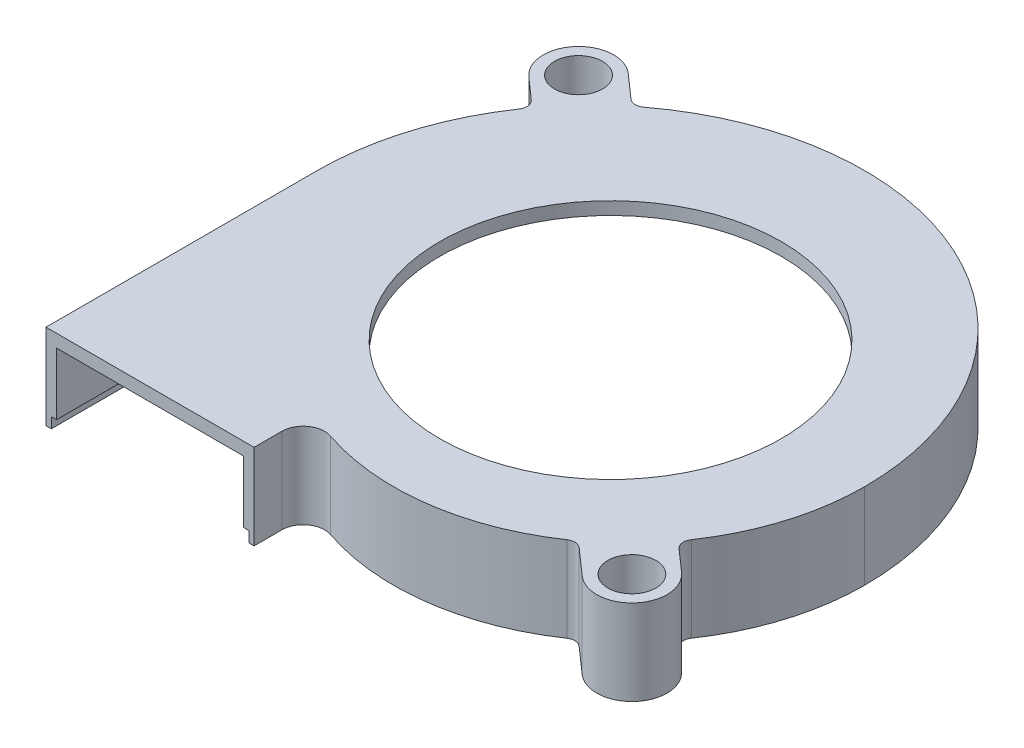
ISO-10303-21;
HEADER;
FILE_DESCRIPTION(('STEP AP214'),'2;1');
FILE_NAME('part.step','',(''),(''),'','','');
FILE_SCHEMA(('AUTOMOTIVE_DESIGN { 1 0 10303 214 1 1 1 1 }'));
ENDSEC;
DATA;
#1=APPLICATION_CONTEXT('core data for automotive mechanical design processes');
#2=APPLICATION_PROTOCOL_DEFINITION('international standard','automotive_design',2000,#1);
#3=PRODUCT_CONTEXT('',#1,'mechanical');
#4=PRODUCT('Part','Part','',(#3));
#5=PRODUCT_RELATED_PRODUCT_CATEGORY('part','',(#4));
#6=PRODUCT_DEFINITION_FORMATION('','',#4);
#7=PRODUCT_DEFINITION_CONTEXT('part definition',#1,'design');
#8=PRODUCT_DEFINITION('design','',#6,#7);
#9=PRODUCT_DEFINITION_SHAPE('','',#8);
#10=(LENGTH_UNIT() NAMED_UNIT(*) SI_UNIT(.MILLI.,.METRE.));
#11=(NAMED_UNIT(*) PLANE_ANGLE_UNIT() SI_UNIT($,.RADIAN.));
#12=(NAMED_UNIT(*) SI_UNIT($,.STERADIAN.) SOLID_ANGLE_UNIT());
#13=UNCERTAINTY_MEASURE_WITH_UNIT(LENGTH_MEASURE(1.E-05),#10,'distance_accuracy_value','');
#14=(GEOMETRIC_REPRESENTATION_CONTEXT(3) GLOBAL_UNCERTAINTY_ASSIGNED_CONTEXT((#13)) GLOBAL_UNIT_ASSIGNED_CONTEXT((#10,
#11,#12)) REPRESENTATION_CONTEXT('',''));
#15=CARTESIAN_POINT('',(0.,0.,0.));
#16=DIRECTION('',(0.,0.,1.));
#17=DIRECTION('',(1.,0.,0.));
#18=AXIS2_PLACEMENT_3D('',#15,#16,#17);
#19=CARTESIAN_POINT('',(-9.,70.26503959981,25.4));
#20=DIRECTION('',(1.,0.,0.));
#21=DIRECTION('',(0.,0.,-1.));
#22=AXIS2_PLACEMENT_3D('',#19,#20,#21);
#23=PLANE('',#22);
#24=DIRECTION('',(0.,0.,-1.));
#25=VECTOR('',#24,1.);
#26=CARTESIAN_POINT('',(-9.,-7.,22.7923029909277));
#27=LINE('',#26,#25);
#28=CARTESIAN_POINT('',(-9.,-7.,25.4));
#29=VERTEX_POINT('',#28);
#30=CARTESIAN_POINT('',(-9.,-7.,22.7923029909277));
#31=VERTEX_POINT('',#30);
#32=EDGE_CURVE('E583',#29,#31,#27,.T.);
#33=ORIENTED_EDGE('',*,*,#32,.F.);
#34=DIRECTION('',(0.,-1.,0.));
#35=VECTOR('',#34,1.);
#36=CARTESIAN_POINT('',(-9.,70.26503959981,25.4));
#37=LINE('',#36,#35);
#38=CARTESIAN_POINT('',(-9.,-1.20000000000001,25.4));
#39=VERTEX_POINT('',#38);
#40=EDGE_CURVE('E494',#39,#29,#37,.T.);
#41=ORIENTED_EDGE('',*,*,#40,.F.);
#42=DIRECTION('',(0.,0.,-1.));
#43=VECTOR('',#42,1.);
#44=CARTESIAN_POINT('',(-9.,-1.20000000000001,25.4));
#45=LINE('',#44,#43);
#46=CARTESIAN_POINT('',(-9.,-1.20000000000001,22.7923029909277));
#47=VERTEX_POINT('',#46);
#48=EDGE_CURVE('E586',#39,#47,#45,.T.);
#49=ORIENTED_EDGE('',*,*,#48,.T.);
#50=DIRECTION('',(0.,-1.,0.));
#51=VECTOR('',#50,1.);
#52=CARTESIAN_POINT('',(-9.,70.26503959981,22.7923029909277));
#53=LINE('',#52,#51);
#54=EDGE_CURVE('E498',#47,#31,#53,.T.);
#55=ORIENTED_EDGE('',*,*,#54,.T.);
#56=EDGE_LOOP('',(#33,#41,#49,#55));
#57=FACE_BOUND('',#56,.T.);
#58=ADVANCED_FACE('F34',(#57),#23,.F.);
#59=CARTESIAN_POINT('',(-6.,70.26503959981,22.7923029909277));
#60=DIRECTION('',(0.,-1.,0.));
#61=DIRECTION('',(0.,0.,-1.));
#62=AXIS2_PLACEMENT_3D('',#59,#60,#61);
#63=CYLINDRICAL_SURFACE('',#62,3.);
#64=CARTESIAN_POINT('',(-6.,-7.,22.7923029909277));
#65=DIRECTION('',(0.,-1.,0.));
#66=DIRECTION('',(0.,0.,-1.));
#67=AXIS2_PLACEMENT_3D('',#64,#65,#66);
#68=CIRCLE('',#67,3.);
#69=CARTESIAN_POINT('',(-5.036241751353,-7.,19.9513225197105));
#70=VERTEX_POINT('',#69);
#71=EDGE_CURVE('E572',#31,#70,#68,.T.);
#72=ORIENTED_EDGE('',*,*,#71,.F.);
#73=ORIENTED_EDGE('',*,*,#54,.F.);
#74=CARTESIAN_POINT('',(-6.,-1.20000000000001,22.7923029909277));
#75=DIRECTION('',(0.,-1.,0.));
#76=DIRECTION('',(0.,0.,-1.));
#77=AXIS2_PLACEMENT_3D('',#74,#75,#76);
#78=CIRCLE('',#77,3.);
#79=CARTESIAN_POINT('',(-5.0362417513355,-1.20000000000001,19.9513225196588));
#80=VERTEX_POINT('',#79);
#81=EDGE_CURVE('E485',#47,#80,#78,.T.);
#82=ORIENTED_EDGE('',*,*,#81,.T.);
#83=DIRECTION('',(0.,-1.,0.));
#84=VECTOR('',#83,1.);
#85=CARTESIAN_POINT('',(-5.0362417513355,70.26503959981,19.9513225196588));
#86=LINE('',#85,#84);
#87=EDGE_CURVE('E482',#80,#70,#86,.T.);
#88=ORIENTED_EDGE('',*,*,#87,.T.);
#89=EDGE_LOOP('',(#72,#73,#82,#88));
#90=FACE_BOUND('',#89,.T.);
#91=ADVANCED_FACE('F303',(#90),#63,.T.);
#92=CARTESIAN_POINT('',(1.73193277310925,70.26503959981,0.));
#93=DIRECTION('',(0.,-1.,0.));
#94=DIRECTION('',(0.,0.,-1.));
#95=AXIS2_PLACEMENT_3D('',#92,#93,#94);
#96=CYLINDRICAL_SURFACE('',#95,21.0680672268908);
#97=CARTESIAN_POINT('',(1.73193277310925,-7.,0.));
#98=DIRECTION('',(0.,1.,0.));
#99=DIRECTION('',(0.,0.,-1.));
#100=AXIS2_PLACEMENT_3D('',#97,#98,#99);
#101=CIRCLE('',#100,21.0680672269453);
#102=CARTESIAN_POINT('',(22.800000024916,-7.,-0.000327043078988983));
#103=VERTEX_POINT('',#102);
#104=EDGE_CURVE('E599',#70,#103,#101,.T.);
#105=ORIENTED_EDGE('',*,*,#104,.F.);
#106=ORIENTED_EDGE('',*,*,#87,.F.);
#107=CARTESIAN_POINT('',(1.73193277310925,-1.20000000000001,0.));
#108=DIRECTION('',(0.,-1.,0.));
#109=DIRECTION('',(0.,0.,-1.));
#110=AXIS2_PLACEMENT_3D('',#107,#108,#109);
#111=CIRCLE('',#110,21.0680672268908);
#112=CARTESIAN_POINT('',(22.7999999974641,-1.20000000000001,-0.000326883646344434));
#113=VERTEX_POINT('',#112);
#114=EDGE_CURVE('E476',#80,#113,#111,.F.);
#115=ORIENTED_EDGE('',*,*,#114,.T.);
#116=DIRECTION('',(0.,-1.,0.));
#117=VECTOR('',#116,1.);
#118=CARTESIAN_POINT('',(22.7999999974641,70.26503959981,-0.000326883646344434));
#119=LINE('',#118,#117);
#120=EDGE_CURVE('E480',#113,#103,#119,.T.);
#121=ORIENTED_EDGE('',*,*,#120,.T.);
#122=EDGE_LOOP('',(#105,#106,#115,#121));
#123=FACE_BOUND('',#122,.T.);
#124=ADVANCED_FACE('F309',(#123),#96,.F.);
#125=CARTESIAN_POINT('',(-1.85,70.26503959981,-0.016796874999999));
#126=DIRECTION('',(0.,-1.,0.));
#127=DIRECTION('',(0.,0.,-1.));
#128=AXIS2_PLACEMENT_3D('',#125,#126,#127);
#129=CYLINDRICAL_SURFACE('',#128,24.6500054997072);
#130=CARTESIAN_POINT('',(-1.85,-7.,-0.016796874999999));
#131=DIRECTION('',(0.,1.,0.));
#132=DIRECTION('',(0.,0.,-1.));
#133=AXIS2_PLACEMENT_3D('',#130,#131,#132);
#134=CIRCLE('',#133,24.6500055270525);
#135=CARTESIAN_POINT('',(-26.5000000525161,-7.00000000000001,-0.000327424430267257));
#136=VERTEX_POINT('',#135);
#137=EDGE_CURVE('E51',#103,#136,#134,.T.);
#138=ORIENTED_EDGE('',*,*,#137,.F.);
#139=ORIENTED_EDGE('',*,*,#120,.F.);
#140=CARTESIAN_POINT('',(-1.85,-1.20000000000001,-0.016796874999999));
#141=DIRECTION('',(0.,-1.,0.));
#142=DIRECTION('',(0.,0.,-1.));
#143=AXIS2_PLACEMENT_3D('',#140,#141,#142);
#144=CIRCLE('',#143,24.6500054997072);
#145=CARTESIAN_POINT('',(-26.5000000525161,-1.20000000000001,-0.000327424430267257));
#146=VERTEX_POINT('',#145);
#147=EDGE_CURVE('E486',#113,#146,#144,.F.);
#148=ORIENTED_EDGE('',*,*,#147,.T.);
#149=DIRECTION('',(0.,-1.,0.));
#150=VECTOR('',#149,1.);
#151=CARTESIAN_POINT('',(-26.5000000525161,70.26503959981,-0.000327424430267257));
#152=LINE('',#151,#150);
#153=EDGE_CURVE('E496',#146,#136,#152,.T.);
#154=ORIENTED_EDGE('',*,*,#153,.T.);
#155=EDGE_LOOP('',(#138,#139,#148,#154));
#156=FACE_BOUND('',#155,.T.);
#157=ADVANCED_FACE('F319',(#156),#129,.F.);
#158=CARTESIAN_POINT('',(-26.5000001072067,70.26503959981,-0.000327424393735107));
#159=DIRECTION('',(-1.,0.,4.22068338812948E-09));
#160=DIRECTION('',(4.22068338812948E-09,0.,1.));
#161=AXIS2_PLACEMENT_3D('',#158,#159,#160);
#162=PLANE('',#161);
#163=DIRECTION('',(-4.28055939719574E-11,0.,1.));
#164=VECTOR('',#163,1.);
#165=CARTESIAN_POINT('',(-26.5000000536034,-7.,25.4));
#166=LINE('',#165,#164);
#167=CARTESIAN_POINT('',(-26.5000000536034,-7.,25.4));
#168=VERTEX_POINT('',#167);
#169=EDGE_CURVE('E604',#136,#168,#166,.T.);
#170=ORIENTED_EDGE('',*,*,#169,.F.);
#171=ORIENTED_EDGE('',*,*,#153,.F.);
#172=DIRECTION('',(4.22068338812948E-09,0.,1.));
#173=VECTOR('',#172,1.);
#174=CARTESIAN_POINT('',(-26.5000001072067,-1.20000000000001,-0.000327424393735107));
#175=LINE('',#174,#173);
#176=CARTESIAN_POINT('',(-26.5,-1.20000000000001,25.4));
#177=VERTEX_POINT('',#176);
#178=EDGE_CURVE('E491',#146,#177,#175,.T.);
#179=ORIENTED_EDGE('',*,*,#178,.T.);
#180=DIRECTION('',(0.,-1.,0.));
#181=VECTOR('',#180,1.);
#182=CARTESIAN_POINT('',(-26.5,70.26503959981,25.4));
#183=LINE('',#182,#181);
#184=EDGE_CURVE('E500',#177,#168,#183,.T.);
#185=ORIENTED_EDGE('',*,*,#184,.T.);
#186=EDGE_LOOP('',(#170,#171,#179,#185));
#187=FACE_BOUND('',#186,.T.);
#188=ADVANCED_FACE('F323',(#187),#162,.F.);
#189=CARTESIAN_POINT('',(0.,-8.,0.));
#190=DIRECTION('',(0.,1.,0.));
#191=DIRECTION('',(0.,0.,1.));
#192=AXIS2_PLACEMENT_3D('',#189,#190,#191);
#193=CYLINDRICAL_SURFACE('',#192,16.);
#194=CARTESIAN_POINT('',(0.,0.,0.));
#195=DIRECTION('',(0.,1.,0.));
#196=DIRECTION('',(0.,0.,1.));
#197=AXIS2_PLACEMENT_3D('',#194,#195,#196);
#198=CIRCLE('',#197,16.);
#199=CARTESIAN_POINT('',(0.,0.,16.));
#200=VERTEX_POINT('',#199);
#201=EDGE_CURVE('E347',#200,#200,#198,.T.);
#202=ORIENTED_EDGE('',*,*,#201,.T.);
#203=EDGE_LOOP('',(#202));
#204=FACE_BOUND('',#203,.T.);
#205=CARTESIAN_POINT('',(0.,-1.2,0.));
#206=DIRECTION('',(0.,-1.,0.));
#207=DIRECTION('',(0.,0.,-1.));
#208=AXIS2_PLACEMENT_3D('',#205,#206,#207);
#209=CIRCLE('',#208,16.);
#210=CARTESIAN_POINT('',(0.,-1.2,-16.));
#211=VERTEX_POINT('',#210);
#212=EDGE_CURVE('E38',#211,#211,#209,.F.);
#213=ORIENTED_EDGE('',*,*,#212,.F.);
#214=EDGE_LOOP('',(#213));
#215=FACE_BOUND('',#214,.T.);
#216=ADVANCED_FACE('F300',(#204,#215),#193,.F.);
#217=CARTESIAN_POINT('',(-23.,-8.,-20.));
#218=DIRECTION('',(0.,1.,0.));
#219=DIRECTION('',(0.,0.,1.));
#220=AXIS2_PLACEMENT_3D('',#217,#218,#219);
#221=CYLINDRICAL_SURFACE('',#220,3.3);
#222=CARTESIAN_POINT('',(-23.,0.,-20.));
#223=DIRECTION('',(0.,1.,0.));
#224=DIRECTION('',(0.,0.,-1.));
#225=AXIS2_PLACEMENT_3D('',#222,#223,#224);
#226=CIRCLE('',#225,3.3);
#227=CARTESIAN_POINT('',(-20.8147472716434,0.,-22.4727859820878));
#228=VERTEX_POINT('',#227);
#229=CARTESIAN_POINT('',(-25.1852527283566,0.,-17.5272140179122));
#230=VERTEX_POINT('',#229);
#231=EDGE_CURVE('E208',#228,#230,#226,.T.);
#232=ORIENTED_EDGE('',*,*,#231,.F.);
#233=DIRECTION('',(0.,1.,0.));
#234=VECTOR('',#233,1.);
#235=CARTESIAN_POINT('',(-20.8147472716434,-8.,-22.4727859820878));
#236=LINE('',#235,#234);
#237=CARTESIAN_POINT('',(-20.8147472716434,-8.,-22.4727859820878));
#238=VERTEX_POINT('',#237);
#239=EDGE_CURVE('E12',#238,#228,#236,.T.);
#240=ORIENTED_EDGE('',*,*,#239,.F.);
#241=CARTESIAN_POINT('',(-23.,-8.,-20.));
#242=DIRECTION('',(0.,1.,0.));
#243=DIRECTION('',(0.,0.,-1.));
#244=AXIS2_PLACEMENT_3D('',#241,#242,#243);
#245=CIRCLE('',#244,3.3);
#246=CARTESIAN_POINT('',(-25.1852527283566,-8.,-17.5272140179122));
#247=VERTEX_POINT('',#246);
#248=EDGE_CURVE('E259',#238,#247,#245,.T.);
#249=ORIENTED_EDGE('',*,*,#248,.T.);
#250=DIRECTION('',(0.,1.,0.));
#251=VECTOR('',#250,1.);
#252=CARTESIAN_POINT('',(-25.1852527283566,-8.,-17.5272140179122));
#253=LINE('',#252,#251);
#254=EDGE_CURVE('E127',#247,#230,#253,.T.);
#255=ORIENTED_EDGE('',*,*,#254,.T.);
#256=EDGE_LOOP('',(#232,#240,#249,#255));
#257=FACE_BOUND('',#256,.T.);
#258=ADVANCED_FACE('F36',(#257),#221,.T.);
#259=CARTESIAN_POINT('',(-20.8147472716434,-8.,-22.4727859820878));
#260=DIRECTION('',(0.66219779647171,0.,-0.749329085481147));
#261=DIRECTION('',(-0.749329085481147,0.,-0.66219779647171));
#262=AXIS2_PLACEMENT_3D('',#259,#260,#261);
#263=PLANE('',#262);
#264=DIRECTION('',(-0.749329085481147,0.,-0.66219779647171));
#265=VECTOR('',#264,1.);
#266=CARTESIAN_POINT('',(-20.8147472716434,0.,-22.4727859820878));
#267=LINE('',#266,#265);
#268=CARTESIAN_POINT('',(-18.5989053771657,0.,-20.5146001218517));
#269=VERTEX_POINT('',#268);
#270=EDGE_CURVE('E257',#269,#228,#267,.T.);
#271=ORIENTED_EDGE('',*,*,#270,.F.);
#272=DIRECTION('',(0.,1.,0.));
#273=VECTOR('',#272,1.);
#274=CARTESIAN_POINT('',(-18.5989053771657,-8.,-20.5146001218517));
#275=LINE('',#274,#273);
#276=CARTESIAN_POINT('',(-18.5989053771657,-8.,-20.5146001218517));
#277=VERTEX_POINT('',#276);
#278=EDGE_CURVE('E43',#277,#269,#275,.T.);
#279=ORIENTED_EDGE('',*,*,#278,.F.);
#280=DIRECTION('',(-0.749329085481147,0.,-0.66219779647171));
#281=VECTOR('',#280,1.);
#282=CARTESIAN_POINT('',(-20.8147472716434,-8.,-22.4727859820878));
#283=LINE('',#282,#281);
#284=EDGE_CURVE('E198',#277,#238,#283,.T.);
#285=ORIENTED_EDGE('',*,*,#284,.T.);
#286=ORIENTED_EDGE('',*,*,#239,.T.);
#287=EDGE_LOOP('',(#271,#279,#285,#286));
#288=FACE_BOUND('',#287,.T.);
#289=ADVANCED_FACE('F292',(#288),#263,.T.);
#290=CARTESIAN_POINT('',(-17.936707580694,-8.,-21.2639292073329));
#291=DIRECTION('',(0.,1.,0.));
#292=DIRECTION('',(0.,0.,1.));
#293=AXIS2_PLACEMENT_3D('',#290,#291,#292);
#294=CYLINDRICAL_SURFACE('',#293,1.);
#295=CARTESIAN_POINT('',(-17.936707580694,0.,-21.2639292073329));
#296=DIRECTION('',(0.,-1.,0.));
#297=DIRECTION('',(0.,0.,1.));
#298=AXIS2_PLACEMENT_3D('',#295,#296,#297);
#299=CIRCLE('',#298,1.);
#300=CARTESIAN_POINT('',(-17.3330789029862,0.,-20.4666636183045));
#301=VERTEX_POINT('',#300);
#302=EDGE_CURVE('E183',#301,#269,#299,.T.);
#303=ORIENTED_EDGE('',*,*,#302,.F.);
#304=DIRECTION('',(0.,1.,0.));
#305=VECTOR('',#304,1.);
#306=CARTESIAN_POINT('',(-17.3330789029862,-8.,-20.4666636183045));
#307=LINE('',#306,#305);
#308=CARTESIAN_POINT('',(-17.3330789029862,-8.,-20.4666636183045));
#309=VERTEX_POINT('',#308);
#310=EDGE_CURVE('E177',#309,#301,#307,.T.);
#311=ORIENTED_EDGE('',*,*,#310,.F.);
#312=CARTESIAN_POINT('',(-17.936707580694,-8.,-21.2639292073329));
#313=DIRECTION('',(0.,-1.,0.));
#314=DIRECTION('',(0.,0.,1.));
#315=AXIS2_PLACEMENT_3D('',#312,#313,#314);
#316=CIRCLE('',#315,1.);
#317=EDGE_CURVE('E180',#309,#277,#316,.T.);
#318=ORIENTED_EDGE('',*,*,#317,.T.);
#319=ORIENTED_EDGE('',*,*,#278,.T.);
#320=EDGE_LOOP('',(#303,#311,#318,#319));
#321=FACE_BOUND('',#320,.T.);
#322=ADVANCED_FACE('F179',(#321),#294,.F.);
#323=CARTESIAN_POINT('',(-1.85,-8.,-0.016796874999999));
#324=DIRECTION('',(0.,1.,0.));
#325=DIRECTION('',(0.,0.,1.));
#326=AXIS2_PLACEMENT_3D('',#323,#324,#325);
#327=CYLINDRICAL_SURFACE('',#326,25.6500054997072);
#328=CARTESIAN_POINT('',(-1.85,0.,-0.016796874999999));
#329=DIRECTION('',(0.,1.,0.));
#330=DIRECTION('',(0.,0.,1.));
#331=AXIS2_PLACEMENT_3D('',#328,#329,#330);
#332=CIRCLE('',#331,25.6500054997072);
#333=CARTESIAN_POINT('',(23.8,0.,0.));
#334=VERTEX_POINT('',#333);
#335=EDGE_CURVE('E254',#334,#301,#332,.T.);
#336=ORIENTED_EDGE('',*,*,#335,.F.);
#337=DIRECTION('',(0.,1.,0.));
#338=VECTOR('',#337,1.);
#339=CARTESIAN_POINT('',(23.8,-8.,0.));
#340=LINE('',#339,#338);
#341=CARTESIAN_POINT('',(23.8,-8.,0.));
#342=VERTEX_POINT('',#341);
#343=EDGE_CURVE('E188',#342,#334,#340,.T.);
#344=ORIENTED_EDGE('',*,*,#343,.F.);
#345=CARTESIAN_POINT('',(-1.85,-8.,-0.016796874999999));
#346=DIRECTION('',(0.,1.,0.));
#347=DIRECTION('',(0.,0.,1.));
#348=AXIS2_PLACEMENT_3D('',#345,#346,#347);
#349=CIRCLE('',#348,25.6500054997072);
#350=EDGE_CURVE('E196',#342,#309,#349,.T.);
#351=ORIENTED_EDGE('',*,*,#350,.T.);
#352=ORIENTED_EDGE('',*,*,#310,.T.);
#353=EDGE_LOOP('',(#336,#344,#351,#352));
#354=FACE_BOUND('',#353,.T.);
#355=ADVANCED_FACE('F200',(#354),#327,.T.);
#356=CARTESIAN_POINT('',(1.73193277310925,-8.,0.));
#357=DIRECTION('',(0.,1.,0.));
#358=DIRECTION('',(0.,0.,1.));
#359=AXIS2_PLACEMENT_3D('',#356,#357,#358);
#360=CYLINDRICAL_SURFACE('',#359,22.0680672268908);
#361=CARTESIAN_POINT('',(1.73193277310925,0.,0.));
#362=DIRECTION('',(0.,1.,0.));
#363=DIRECTION('',(0.,0.,-1.));
#364=AXIS2_PLACEMENT_3D('',#361,#362,#363);
#365=CIRCLE('',#364,22.0680672268908);
#366=CARTESIAN_POINT('',(19.9790752063348,0.,12.4113409489929));
#367=VERTEX_POINT('',#366);
#368=EDGE_CURVE('E251',#367,#334,#365,.T.);
#369=ORIENTED_EDGE('',*,*,#368,.F.);
#370=DIRECTION('',(0.,1.,0.));
#371=VECTOR('',#370,1.);
#372=CARTESIAN_POINT('',(19.9790752063348,-8.,12.4113409489929));
#373=LINE('',#372,#371);
#374=CARTESIAN_POINT('',(19.9790752063348,-8.,12.4113409489929));
#375=VERTEX_POINT('',#374);
#376=EDGE_CURVE('E263',#375,#367,#373,.T.);
#377=ORIENTED_EDGE('',*,*,#376,.F.);
#378=CARTESIAN_POINT('',(1.73193277310925,-8.,0.));
#379=DIRECTION('',(0.,1.,0.));
#380=DIRECTION('',(0.,0.,-1.));
#381=AXIS2_PLACEMENT_3D('',#378,#379,#380);
#382=CIRCLE('',#381,22.0680672268908);
#383=EDGE_CURVE('E201',#375,#342,#382,.T.);
#384=ORIENTED_EDGE('',*,*,#383,.T.);
#385=ORIENTED_EDGE('',*,*,#343,.T.);
#386=EDGE_LOOP('',(#369,#377,#384,#385));
#387=FACE_BOUND('',#386,.T.);
#388=ADVANCED_FACE('F662',(#387),#360,.T.);
#389=CARTESIAN_POINT('',(20.8059325040591,-8.,12.9737527280304));
#390=DIRECTION('',(0.,1.,0.));
#391=DIRECTION('',(0.,0.,1.));
#392=AXIS2_PLACEMENT_3D('',#389,#390,#391);
#393=CYLINDRICAL_SURFACE('',#392,1.);
#394=CARTESIAN_POINT('',(20.8059325040591,0.,12.9737527280304));
#395=DIRECTION('',(0.,-1.,0.));
#396=DIRECTION('',(0.,0.,-1.));
#397=AXIS2_PLACEMENT_3D('',#394,#395,#396);
#398=CIRCLE('',#397,1.);
#399=CARTESIAN_POINT('',(20.1437347075874,0.,13.7230818135115));
#400=VERTEX_POINT('',#399);
#401=EDGE_CURVE('E248',#400,#367,#398,.T.);
#402=ORIENTED_EDGE('',*,*,#401,.F.);
#403=DIRECTION('',(0.,1.,0.));
#404=VECTOR('',#403,1.);
#405=CARTESIAN_POINT('',(20.1437347075874,-8.,13.7230818135115));
#406=LINE('',#405,#404);
#407=CARTESIAN_POINT('',(20.1437347075874,-8.,13.7230818135115));
#408=VERTEX_POINT('',#407);
#409=EDGE_CURVE('E265',#408,#400,#406,.T.);
#410=ORIENTED_EDGE('',*,*,#409,.F.);
#411=CARTESIAN_POINT('',(20.8059325040591,-8.,12.9737527280304));
#412=DIRECTION('',(0.,-1.,0.));
#413=DIRECTION('',(0.,0.,-1.));
#414=AXIS2_PLACEMENT_3D('',#411,#412,#413);
#415=CIRCLE('',#414,1.);
#416=EDGE_CURVE('E203',#408,#375,#415,.T.);
#417=ORIENTED_EDGE('',*,*,#416,.T.);
#418=ORIENTED_EDGE('',*,*,#376,.T.);
#419=EDGE_LOOP('',(#402,#410,#417,#418));
#420=FACE_BOUND('',#419,.T.);
#421=ADVANCED_FACE('F404',(#420),#393,.F.);
#422=CARTESIAN_POINT('',(22.1852527283566,-8.,15.5272140179122));
#423=DIRECTION('',(0.66219779647171,0.,-0.749329085481147));
#424=DIRECTION('',(-0.749329085481147,0.,-0.66219779647171));
#425=AXIS2_PLACEMENT_3D('',#422,#423,#424);
#426=PLANE('',#425);
#427=DIRECTION('',(-0.749329085481146,0.,-0.66219779647171));
#428=VECTOR('',#427,1.);
#429=CARTESIAN_POINT('',(22.1852527283566,0.,15.5272140179122));
#430=LINE('',#429,#428);
#431=CARTESIAN_POINT('',(22.1852527283566,0.,15.5272140179122));
#432=VERTEX_POINT('',#431);
#433=EDGE_CURVE('E245',#432,#400,#430,.T.);
#434=ORIENTED_EDGE('',*,*,#433,.F.);
#435=DIRECTION('',(0.,1.,0.));
#436=VECTOR('',#435,1.);
#437=CARTESIAN_POINT('',(22.1852527283566,-8.,15.5272140179122));
#438=LINE('',#437,#436);
#439=CARTESIAN_POINT('',(22.1852527283566,-8.,15.5272140179122));
#440=VERTEX_POINT('',#439);
#441=EDGE_CURVE('E267',#440,#432,#438,.T.);
#442=ORIENTED_EDGE('',*,*,#441,.F.);
#443=DIRECTION('',(-0.749329085481146,0.,-0.66219779647171));
#444=VECTOR('',#443,1.);
#445=CARTESIAN_POINT('',(22.1852527283566,-8.,15.5272140179122));
#446=LINE('',#445,#444);
#447=EDGE_CURVE('E398',#440,#408,#446,.T.);
#448=ORIENTED_EDGE('',*,*,#447,.T.);
#449=ORIENTED_EDGE('',*,*,#409,.T.);
#450=EDGE_LOOP('',(#434,#442,#448,#449));
#451=FACE_BOUND('',#450,.T.);
#452=ADVANCED_FACE('F410',(#451),#426,.T.);
#453=CARTESIAN_POINT('',(20.,-8.,18.));
#454=DIRECTION('',(0.,1.,0.));
#455=DIRECTION('',(0.,0.,1.));
#456=AXIS2_PLACEMENT_3D('',#453,#454,#455);
#457=CYLINDRICAL_SURFACE('',#456,3.3);
#458=CARTESIAN_POINT('',(20.,0.,18.));
#459=DIRECTION('',(0.,1.,0.));
#460=DIRECTION('',(0.,0.,-1.));
#461=AXIS2_PLACEMENT_3D('',#458,#459,#460);
#462=CIRCLE('',#461,3.3);
#463=CARTESIAN_POINT('',(17.8147472716434,0.,20.4727859820878));
#464=VERTEX_POINT('',#463);
#465=EDGE_CURVE('E242',#464,#432,#462,.T.);
#466=ORIENTED_EDGE('',*,*,#465,.F.);
#467=DIRECTION('',(0.,1.,0.));
#468=VECTOR('',#467,1.);
#469=CARTESIAN_POINT('',(17.8147472716434,-8.,20.4727859820878));
#470=LINE('',#469,#468);
#471=CARTESIAN_POINT('',(17.8147472716434,-8.,20.4727859820878));
#472=VERTEX_POINT('',#471);
#473=EDGE_CURVE('E269',#472,#464,#470,.T.);
#474=ORIENTED_EDGE('',*,*,#473,.F.);
#475=CARTESIAN_POINT('',(20.,-8.,18.));
#476=DIRECTION('',(0.,1.,0.));
#477=DIRECTION('',(0.,0.,-1.));
#478=AXIS2_PLACEMENT_3D('',#475,#476,#477);
#479=CIRCLE('',#478,3.3);
#480=EDGE_CURVE('E395',#472,#440,#479,.T.);
#481=ORIENTED_EDGE('',*,*,#480,.T.);
#482=ORIENTED_EDGE('',*,*,#441,.T.);
#483=EDGE_LOOP('',(#466,#474,#481,#482));
#484=FACE_BOUND('',#483,.T.);
#485=ADVANCED_FACE('F413',(#484),#457,.T.);
#486=CARTESIAN_POINT('',(17.8147472716434,-8.,20.4727859820878));
#487=DIRECTION('',(-0.66219779647171,0.,0.749329085481147));
#488=DIRECTION('',(0.749329085481147,0.,0.66219779647171));
#489=AXIS2_PLACEMENT_3D('',#486,#487,#488);
#490=PLANE('',#489);
#491=DIRECTION('',(0.749329085481147,0.,0.66219779647171));
#492=VECTOR('',#491,1.);
#493=CARTESIAN_POINT('',(17.8147472716434,0.,20.4727859820878));
#494=LINE('',#493,#492);
#495=CARTESIAN_POINT('',(15.3769800356374,0.,18.3184800525942));
#496=VERTEX_POINT('',#495);
#497=EDGE_CURVE('E239',#496,#464,#494,.T.);
#498=ORIENTED_EDGE('',*,*,#497,.F.);
#499=DIRECTION('',(0.,1.,0.));
#500=VECTOR('',#499,1.);
#501=CARTESIAN_POINT('',(15.3769800356374,-8.,18.3184800525942));
#502=LINE('',#501,#500);
#503=CARTESIAN_POINT('',(15.3769800356374,-8.,18.3184800525942));
#504=VERTEX_POINT('',#503);
#505=EDGE_CURVE('E271',#504,#496,#502,.T.);
#506=ORIENTED_EDGE('',*,*,#505,.F.);
#507=DIRECTION('',(0.749329085481147,0.,0.66219779647171));
#508=VECTOR('',#507,1.);
#509=CARTESIAN_POINT('',(17.8147472716434,-8.,20.4727859820878));
#510=LINE('',#509,#508);
#511=EDGE_CURVE('E392',#504,#472,#510,.T.);
#512=ORIENTED_EDGE('',*,*,#511,.T.);
#513=ORIENTED_EDGE('',*,*,#473,.T.);
#514=EDGE_LOOP('',(#498,#506,#512,#513));
#515=FACE_BOUND('',#514,.T.);
#516=ADVANCED_FACE('F418',(#515),#490,.T.);
#517=CARTESIAN_POINT('',(14.7147822391657,-8.,19.0678091380753));
#518=DIRECTION('',(0.,1.,0.));
#519=DIRECTION('',(0.,0.,1.));
#520=AXIS2_PLACEMENT_3D('',#517,#518,#519);
#521=CYLINDRICAL_SURFACE('',#520,0.999999999999999);
#522=CARTESIAN_POINT('',(14.7147822391657,0.,19.0678091380753));
#523=DIRECTION('',(0.,-1.,0.));
#524=DIRECTION('',(0.,0.,1.));
#525=AXIS2_PLACEMENT_3D('',#522,#523,#524);
#526=CIRCLE('',#525,0.999999999999999);
#527=CARTESIAN_POINT('',(14.1519761168165,0.,18.2412202023604));
#528=VERTEX_POINT('',#527);
#529=EDGE_CURVE('E236',#528,#496,#526,.T.);
#530=ORIENTED_EDGE('',*,*,#529,.F.);
#531=DIRECTION('',(0.,1.,0.));
#532=VECTOR('',#531,1.);
#533=CARTESIAN_POINT('',(14.1519761168165,-8.,18.2412202023604));
#534=LINE('',#533,#532);
#535=CARTESIAN_POINT('',(14.1519761168165,-8.,18.2412202023604));
#536=VERTEX_POINT('',#535);
#537=EDGE_CURVE('E273',#536,#528,#534,.T.);
#538=ORIENTED_EDGE('',*,*,#537,.F.);
#539=CARTESIAN_POINT('',(14.7147822391657,-8.,19.0678091380753));
#540=DIRECTION('',(0.,-1.,0.));
#541=DIRECTION('',(0.,0.,1.));
#542=AXIS2_PLACEMENT_3D('',#539,#540,#541);
#543=CIRCLE('',#542,0.999999999999999);
#544=EDGE_CURVE('E389',#536,#504,#543,.T.);
#545=ORIENTED_EDGE('',*,*,#544,.T.);
#546=ORIENTED_EDGE('',*,*,#505,.T.);
#547=EDGE_LOOP('',(#530,#538,#545,#546));
#548=FACE_BOUND('',#547,.T.);
#549=ADVANCED_FACE('F421',(#548),#521,.F.);
#550=CARTESIAN_POINT('',(1.73193277310925,-8.,0.));
#551=DIRECTION('',(0.,1.,0.));
#552=DIRECTION('',(0.,0.,1.));
#553=AXIS2_PLACEMENT_3D('',#550,#551,#552);
#554=CYLINDRICAL_SURFACE('',#553,22.0680672268908);
#555=CARTESIAN_POINT('',(1.73193277310925,0.,0.));
#556=DIRECTION('',(0.,1.,0.));
#557=DIRECTION('',(0.,0.,-1.));
#558=AXIS2_PLACEMENT_3D('',#555,#556,#557);
#559=CIRCLE('',#558,22.0680672268908);
#560=CARTESIAN_POINT('',(-5.35749450089033,0.,20.8983160100818));
#561=VERTEX_POINT('',#560);
#562=EDGE_CURVE('E233',#561,#528,#559,.T.);
#563=ORIENTED_EDGE('',*,*,#562,.F.);
#564=DIRECTION('',(0.,1.,0.));
#565=VECTOR('',#564,1.);
#566=CARTESIAN_POINT('',(-5.35749450089033,-8.,20.8983160100818));
#567=LINE('',#566,#565);
#568=CARTESIAN_POINT('',(-5.35749450089033,-8.,20.8983160100818));
#569=VERTEX_POINT('',#568);
#570=EDGE_CURVE('E275',#569,#561,#567,.T.);
#571=ORIENTED_EDGE('',*,*,#570,.F.);
#572=CARTESIAN_POINT('',(1.73193277310925,-8.,0.));
#573=DIRECTION('',(0.,1.,0.));
#574=DIRECTION('',(0.,0.,-1.));
#575=AXIS2_PLACEMENT_3D('',#572,#573,#574);
#576=CIRCLE('',#575,22.0680672268908);
#577=EDGE_CURVE('E386',#569,#536,#576,.T.);
#578=ORIENTED_EDGE('',*,*,#577,.T.);
#579=ORIENTED_EDGE('',*,*,#537,.T.);
#580=EDGE_LOOP('',(#563,#571,#578,#579));
#581=FACE_BOUND('',#580,.T.);
#582=ADVANCED_FACE('F426',(#581),#554,.T.);
#583=CARTESIAN_POINT('',(-6.,-8.,22.7923029909277));
#584=DIRECTION('',(0.,1.,0.));
#585=DIRECTION('',(0.,0.,1.));
#586=AXIS2_PLACEMENT_3D('',#583,#584,#585);
#587=CYLINDRICAL_SURFACE('',#586,2.);
#588=CARTESIAN_POINT('',(-6.,0.,22.7923029909277));
#589=DIRECTION('',(0.,-1.,0.));
#590=DIRECTION('',(0.,0.,1.));
#591=AXIS2_PLACEMENT_3D('',#588,#589,#590);
#592=CIRCLE('',#591,2.);
#593=CARTESIAN_POINT('',(-8.,0.,22.7923029909277));
#594=VERTEX_POINT('',#593);
#595=EDGE_CURVE('E230',#594,#561,#592,.T.);
#596=ORIENTED_EDGE('',*,*,#595,.F.);
#597=DIRECTION('',(0.,1.,0.));
#598=VECTOR('',#597,1.);
#599=CARTESIAN_POINT('',(-8.,-8.,22.7923029909277));
#600=LINE('',#599,#598);
#601=CARTESIAN_POINT('',(-8.,-8.,22.7923029909277));
#602=VERTEX_POINT('',#601);
#603=EDGE_CURVE('E277',#602,#594,#600,.T.);
#604=ORIENTED_EDGE('',*,*,#603,.F.);
#605=CARTESIAN_POINT('',(-6.,-8.,22.7923029909277));
#606=DIRECTION('',(0.,-1.,0.));
#607=DIRECTION('',(0.,0.,1.));
#608=AXIS2_PLACEMENT_3D('',#605,#606,#607);
#609=CIRCLE('',#608,2.);
#610=EDGE_CURVE('E383',#602,#569,#609,.T.);
#611=ORIENTED_EDGE('',*,*,#610,.T.);
#612=ORIENTED_EDGE('',*,*,#570,.T.);
#613=EDGE_LOOP('',(#596,#604,#611,#612));
#614=FACE_BOUND('',#613,.T.);
#615=ADVANCED_FACE('F429',(#614),#587,.F.);
#616=CARTESIAN_POINT('',(-8.,-8.,25.4));
#617=DIRECTION('',(1.,0.,0.));
#618=DIRECTION('',(0.,0.,-1.));
#619=AXIS2_PLACEMENT_3D('',#616,#617,#618);
#620=PLANE('',#619);
#621=DIRECTION('',(0.,0.,-1.));
#622=VECTOR('',#621,1.);
#623=CARTESIAN_POINT('',(-8.,0.,25.4));
#624=LINE('',#623,#622);
#625=CARTESIAN_POINT('',(-8.,0.,25.4));
#626=VERTEX_POINT('',#625);
#627=EDGE_CURVE('E227',#626,#594,#624,.T.);
#628=ORIENTED_EDGE('',*,*,#627,.F.);
#629=DIRECTION('',(0.,1.,0.));
#630=VECTOR('',#629,1.);
#631=CARTESIAN_POINT('',(-8.,-8.,25.4));
#632=LINE('',#631,#630);
#633=CARTESIAN_POINT('',(-8.,-8.,25.4));
#634=VERTEX_POINT('',#633);
#635=EDGE_CURVE('E279',#634,#626,#632,.T.);
#636=ORIENTED_EDGE('',*,*,#635,.F.);
#637=DIRECTION('',(0.,0.,-1.));
#638=VECTOR('',#637,1.);
#639=CARTESIAN_POINT('',(-8.,-8.,25.4));
#640=LINE('',#639,#638);
#641=EDGE_CURVE('E380',#634,#602,#640,.T.);
#642=ORIENTED_EDGE('',*,*,#641,.T.);
#643=ORIENTED_EDGE('',*,*,#603,.T.);
#644=EDGE_LOOP('',(#628,#636,#642,#643));
#645=FACE_BOUND('',#644,.T.);
#646=ADVANCED_FACE('F435',(#645),#620,.T.);
#647=CARTESIAN_POINT('',(-27.5,-8.,25.4));
#648=DIRECTION('',(0.,0.,1.));
#649=DIRECTION('',(1.,0.,0.));
#650=AXIS2_PLACEMENT_3D('',#647,#648,#649);
#651=PLANE('',#650);
#652=DIRECTION('',(0.,-1.,0.));
#653=VECTOR('',#652,1.);
#654=CARTESIAN_POINT('',(-27.0000000525161,-7.,25.4));
#655=LINE('',#654,#653);
#656=CARTESIAN_POINT('',(-27.0000000525161,-7.,25.4));
#657=VERTEX_POINT('',#656);
#658=CARTESIAN_POINT('',(-27.0000000525161,-8.,25.4));
#659=VERTEX_POINT('',#658);
#660=EDGE_CURVE('E553',#657,#659,#655,.T.);
#661=ORIENTED_EDGE('',*,*,#660,.F.);
#662=DIRECTION('',(-1.,0.,0.));
#663=VECTOR('',#662,1.);
#664=CARTESIAN_POINT('',(-27.0000000525161,-7.,25.4));
#665=LINE('',#664,#663);
#666=EDGE_CURVE('E606',#168,#657,#665,.T.);
#667=ORIENTED_EDGE('',*,*,#666,.F.);
#668=ORIENTED_EDGE('',*,*,#184,.F.);
#669=DIRECTION('',(1.,0.,0.));
#670=VECTOR('',#669,1.);
#671=CARTESIAN_POINT('',(-26.5,-1.20000000000001,25.4));
#672=LINE('',#671,#670);
#673=EDGE_CURVE('E507',#177,#39,#672,.T.);
#674=ORIENTED_EDGE('',*,*,#673,.T.);
#675=ORIENTED_EDGE('',*,*,#40,.T.);
#676=DIRECTION('',(-1.,0.,0.));
#677=VECTOR('',#676,1.);
#678=CARTESIAN_POINT('',(-9.,-7.,25.4));
#679=LINE('',#678,#677);
#680=CARTESIAN_POINT('',(-8.5,-7.,25.4));
#681=VERTEX_POINT('',#680);
#682=EDGE_CURVE('E624',#681,#29,#679,.T.);
#683=ORIENTED_EDGE('',*,*,#682,.F.);
#684=DIRECTION('',(0.,-1.,0.));
#685=VECTOR('',#684,1.);
#686=CARTESIAN_POINT('',(-8.5,-7.,25.4));
#687=LINE('',#686,#685);
#688=CARTESIAN_POINT('',(-8.5,-8.,25.4));
#689=VERTEX_POINT('',#688);
#690=EDGE_CURVE('E444',#681,#689,#687,.T.);
#691=ORIENTED_EDGE('',*,*,#690,.T.);
#692=DIRECTION('',(1.,0.,0.));
#693=VECTOR('',#692,1.);
#694=CARTESIAN_POINT('',(-27.5,-8.,25.4));
#695=LINE('',#694,#693);
#696=EDGE_CURVE('E376',#689,#634,#695,.T.);
#697=ORIENTED_EDGE('',*,*,#696,.T.);
#698=ORIENTED_EDGE('',*,*,#635,.T.);
#699=DIRECTION('',(1.,0.,0.));
#700=VECTOR('',#699,1.);
#701=CARTESIAN_POINT('',(-27.5,0.,25.4));
#702=LINE('',#701,#700);
#703=CARTESIAN_POINT('',(-27.5,0.,25.4));
#704=VERTEX_POINT('',#703);
#705=EDGE_CURVE('E224',#704,#626,#702,.T.);
#706=ORIENTED_EDGE('',*,*,#705,.F.);
#707=DIRECTION('',(0.,1.,0.));
#708=VECTOR('',#707,1.);
#709=CARTESIAN_POINT('',(-27.5,-8.,25.4));
#710=LINE('',#709,#708);
#711=CARTESIAN_POINT('',(-27.5,-8.,25.4));
#712=VERTEX_POINT('',#711);
#713=EDGE_CURVE('E281',#712,#704,#710,.T.);
#714=ORIENTED_EDGE('',*,*,#713,.F.);
#715=EDGE_CURVE('E377',#712,#659,#695,.T.);
#716=ORIENTED_EDGE('',*,*,#715,.T.);
#717=EDGE_LOOP('',(#661,#667,#668,#674,#675,#683,#691,#697,#698,#706,#714,#716));
#718=FACE_BOUND('',#717,.T.);
#719=ADVANCED_FACE('F439',(#718),#651,.T.);
#720=CARTESIAN_POINT('',(-27.5,-8.,25.4));
#721=DIRECTION('',(-1.,0.,0.));
#722=DIRECTION('',(0.,0.,1.));
#723=AXIS2_PLACEMENT_3D('',#720,#721,#722);
#724=PLANE('',#723);
#725=DIRECTION('',(0.,0.,1.));
#726=VECTOR('',#725,1.);
#727=CARTESIAN_POINT('',(-27.5,0.,25.4));
#728=LINE('',#727,#726);
#729=CARTESIAN_POINT('',(-27.5,0.,0.));
#730=VERTEX_POINT('',#729);
#731=EDGE_CURVE('E221',#730,#704,#728,.T.);
#732=ORIENTED_EDGE('',*,*,#731,.F.);
#733=DIRECTION('',(0.,1.,0.));
#734=VECTOR('',#733,1.);
#735=CARTESIAN_POINT('',(-27.5,-8.,0.));
#736=LINE('',#735,#734);
#737=CARTESIAN_POINT('',(-27.5,-8.,0.));
#738=VERTEX_POINT('',#737);
#739=EDGE_CURVE('E283',#738,#730,#736,.T.);
#740=ORIENTED_EDGE('',*,*,#739,.F.);
#741=DIRECTION('',(0.,0.,1.));
#742=VECTOR('',#741,1.);
#743=CARTESIAN_POINT('',(-27.5,-8.,25.4));
#744=LINE('',#743,#742);
#745=EDGE_CURVE('E373',#738,#712,#744,.T.);
#746=ORIENTED_EDGE('',*,*,#745,.T.);
#747=ORIENTED_EDGE('',*,*,#713,.T.);
#748=EDGE_LOOP('',(#732,#740,#746,#747));
#749=FACE_BOUND('',#748,.T.);
#750=ADVANCED_FACE('F654',(#749),#724,.T.);
#751=CARTESIAN_POINT('',(-1.85,-8.,-0.016796874999999));
#752=DIRECTION('',(0.,1.,0.));
#753=DIRECTION('',(0.,0.,1.));
#754=AXIS2_PLACEMENT_3D('',#751,#752,#753);
#755=CYLINDRICAL_SURFACE('',#754,25.6500054997072);
#756=CARTESIAN_POINT('',(-1.85,0.,-0.016796874999999));
#757=DIRECTION('',(0.,1.,0.));
#758=DIRECTION('',(0.,0.,1.));
#759=AXIS2_PLACEMENT_3D('',#756,#757,#758);
#760=CIRCLE('',#759,25.6500054997072);
#761=CARTESIAN_POINT('',(-23.0428472901912,0.,-14.4662261325744));
#762=VERTEX_POINT('',#761);
#763=EDGE_CURVE('E218',#762,#730,#760,.T.);
#764=ORIENTED_EDGE('',*,*,#763,.F.);
#765=DIRECTION('',(0.,1.,0.));
#766=VECTOR('',#765,1.);
#767=CARTESIAN_POINT('',(-23.0428472901912,-8.,-14.4662261325744));
#768=LINE('',#767,#766);
#769=CARTESIAN_POINT('',(-23.0428472901912,-8.,-14.4662261325744));
#770=VERTEX_POINT('',#769);
#771=EDGE_CURVE('E285',#770,#762,#768,.T.);
#772=ORIENTED_EDGE('',*,*,#771,.F.);
#773=CARTESIAN_POINT('',(-1.85,-8.,-0.016796874999999));
#774=DIRECTION('',(0.,1.,0.));
#775=DIRECTION('',(0.,0.,1.));
#776=AXIS2_PLACEMENT_3D('',#773,#774,#775);
#777=CIRCLE('',#776,25.6500054997072);
#778=EDGE_CURVE('E370',#770,#738,#777,.T.);
#779=ORIENTED_EDGE('',*,*,#778,.T.);
#780=ORIENTED_EDGE('',*,*,#739,.T.);
#781=EDGE_LOOP('',(#764,#772,#779,#780));
#782=FACE_BOUND('',#781,.T.);
#783=ADVANCED_FACE('F657',(#782),#755,.T.);
#784=CARTESIAN_POINT('',(-23.8690789762013,-8.,-15.0295565871327));
#785=DIRECTION('',(0.,1.,0.));
#786=DIRECTION('',(0.,0.,1.));
#787=AXIS2_PLACEMENT_3D('',#784,#785,#786);
#788=CYLINDRICAL_SURFACE('',#787,1.);
#789=CARTESIAN_POINT('',(-23.8690789762013,0.,-15.0295565871327));
#790=DIRECTION('',(0.,-1.,0.));
#791=DIRECTION('',(0.,0.,-1.));
#792=AXIS2_PLACEMENT_3D('',#789,#790,#791);
#793=CIRCLE('',#792,1.);
#794=CARTESIAN_POINT('',(-23.2068811797296,0.,-15.7788856726139));
#795=VERTEX_POINT('',#794);
#796=EDGE_CURVE('E215',#795,#762,#793,.T.);
#797=ORIENTED_EDGE('',*,*,#796,.F.);
#798=DIRECTION('',(0.,1.,0.));
#799=VECTOR('',#798,1.);
#800=CARTESIAN_POINT('',(-23.2068811797296,-8.,-15.7788856726139));
#801=LINE('',#800,#799);
#802=CARTESIAN_POINT('',(-23.2068811797296,-8.,-15.7788856726139));
#803=VERTEX_POINT('',#802);
#804=EDGE_CURVE('E287',#803,#795,#801,.T.);
#805=ORIENTED_EDGE('',*,*,#804,.F.);
#806=CARTESIAN_POINT('',(-23.8690789762013,-8.,-15.0295565871327));
#807=DIRECTION('',(0.,-1.,0.));
#808=DIRECTION('',(0.,0.,-1.));
#809=AXIS2_PLACEMENT_3D('',#806,#807,#808);
#810=CIRCLE('',#809,1.);
#811=EDGE_CURVE('E367',#803,#770,#810,.T.);
#812=ORIENTED_EDGE('',*,*,#811,.T.);
#813=ORIENTED_EDGE('',*,*,#771,.T.);
#814=EDGE_LOOP('',(#797,#805,#812,#813));
#815=FACE_BOUND('',#814,.T.);
#816=ADVANCED_FACE('F660',(#815),#788,.F.);
#817=CARTESIAN_POINT('',(-25.1852527283566,-8.,-17.5272140179122));
#818=DIRECTION('',(-0.662197796471711,0.,0.749329085481146));
#819=DIRECTION('',(0.749329085481146,0.,0.662197796471711));
#820=AXIS2_PLACEMENT_3D('',#817,#818,#819);
#821=PLANE('',#820);
#822=DIRECTION('',(0.749329085481146,0.,0.662197796471711));
#823=VECTOR('',#822,1.);
#824=CARTESIAN_POINT('',(-25.1852527283566,0.,-17.5272140179122));
#825=LINE('',#824,#823);
#826=EDGE_CURVE('E211',#230,#795,#825,.T.);
#827=ORIENTED_EDGE('',*,*,#826,.F.);
#828=ORIENTED_EDGE('',*,*,#254,.F.);
#829=DIRECTION('',(0.749329085481146,0.,0.662197796471711));
#830=VECTOR('',#829,1.);
#831=CARTESIAN_POINT('',(-25.1852527283566,-8.,-17.5272140179122));
#832=LINE('',#831,#830);
#833=EDGE_CURVE('E365',#247,#803,#832,.T.);
#834=ORIENTED_EDGE('',*,*,#833,.T.);
#835=ORIENTED_EDGE('',*,*,#804,.T.);
#836=EDGE_LOOP('',(#827,#828,#834,#835));
#837=FACE_BOUND('',#836,.T.);
#838=ADVANCED_FACE('F288',(#837),#821,.T.);
#839=CARTESIAN_POINT('',(-23.,-8.,-20.));
#840=DIRECTION('',(0.,-1.,0.));
#841=DIRECTION('',(0.,0.,-1.));
#842=AXIS2_PLACEMENT_3D('',#839,#840,#841);
#843=PLANE('',#842);
#844=DIRECTION('',(0.,0.,1.));
#845=VECTOR('',#844,1.);
#846=CARTESIAN_POINT('',(-8.5,-8.,22.7923029909277));
#847=LINE('',#846,#845);
#848=CARTESIAN_POINT('',(-8.5,-8.,22.7923029909277));
#849=VERTEX_POINT('',#848);
#850=EDGE_CURVE('E448',#849,#689,#847,.T.);
#851=ORIENTED_EDGE('',*,*,#850,.F.);
#852=CARTESIAN_POINT('',(-6.,-8.,22.7923029909277));
#853=DIRECTION('',(0.,1.,0.));
#854=DIRECTION('',(0.,0.,-1.));
#855=AXIS2_PLACEMENT_3D('',#852,#853,#854);
#856=CIRCLE('',#855,2.49999999997275);
#857=CARTESIAN_POINT('',(-5.19686812612168,-8.,20.4248192648961));
#858=VERTEX_POINT('',#857);
#859=EDGE_CURVE('E565',#858,#849,#856,.T.);
#860=ORIENTED_EDGE('',*,*,#859,.F.);
#861=CARTESIAN_POINT('',(1.73193277310925,-8.,0.));
#862=DIRECTION('',(0.,-1.,0.));
#863=DIRECTION('',(0.,0.,-1.));
#864=AXIS2_PLACEMENT_3D('',#861,#862,#863);
#865=CIRCLE('',#864,21.5680672269453);
#866=CARTESIAN_POINT('',(23.2999999997051,-8.,-0.00012277506663749));
#867=VERTEX_POINT('',#866);
#868=EDGE_CURVE('E562',#867,#858,#865,.T.);
#869=ORIENTED_EDGE('',*,*,#868,.F.);
#870=CARTESIAN_POINT('',(-1.85,-8.,-0.016796874999999));
#871=DIRECTION('',(0.,-1.,0.));
#872=DIRECTION('',(0.,0.,-1.));
#873=AXIS2_PLACEMENT_3D('',#870,#871,#872);
#874=CIRCLE('',#873,25.1500055062662);
#875=CARTESIAN_POINT('',(-27.0000000038298,-8.,-0.000160391496041035));
#876=VERTEX_POINT('',#875);
#877=EDGE_CURVE('E557',#876,#867,#874,.T.);
#878=ORIENTED_EDGE('',*,*,#877,.F.);
#879=DIRECTION('',(2.73512697014853E-09,0.,-1.));
#880=VECTOR('',#879,1.);
#881=CARTESIAN_POINT('',(-27.0000000525161,-8.,25.4));
#882=LINE('',#881,#880);
#883=EDGE_CURVE('E545',#659,#876,#882,.T.);
#884=ORIENTED_EDGE('',*,*,#883,.F.);
#885=ORIENTED_EDGE('',*,*,#715,.F.);
#886=ORIENTED_EDGE('',*,*,#745,.F.);
#887=ORIENTED_EDGE('',*,*,#778,.F.);
#888=ORIENTED_EDGE('',*,*,#811,.F.);
#889=ORIENTED_EDGE('',*,*,#833,.F.);
#890=ORIENTED_EDGE('',*,*,#248,.F.);
#891=ORIENTED_EDGE('',*,*,#284,.F.);
#892=ORIENTED_EDGE('',*,*,#317,.F.);
#893=ORIENTED_EDGE('',*,*,#350,.F.);
#894=ORIENTED_EDGE('',*,*,#383,.F.);
#895=ORIENTED_EDGE('',*,*,#416,.F.);
#896=ORIENTED_EDGE('',*,*,#447,.F.);
#897=ORIENTED_EDGE('',*,*,#480,.F.);
#898=ORIENTED_EDGE('',*,*,#511,.F.);
#899=ORIENTED_EDGE('',*,*,#544,.F.);
#900=ORIENTED_EDGE('',*,*,#577,.F.);
#901=ORIENTED_EDGE('',*,*,#610,.F.);
#902=ORIENTED_EDGE('',*,*,#641,.F.);
#903=ORIENTED_EDGE('',*,*,#696,.F.);
#904=EDGE_LOOP('',(#851,#860,#869,#878,#884,#885,#886,#887,#888,#889,#890,#891,#892,#893,#894,
#895,#896,#897,#898,#899,#900,#901,#902,#903));
#905=FACE_BOUND('',#904,.T.);
#906=CARTESIAN_POINT('',(20.,-8.,18.));
#907=DIRECTION('',(0.,1.,0.));
#908=DIRECTION('',(0.,0.,1.));
#909=AXIS2_PLACEMENT_3D('',#906,#907,#908);
#910=CIRCLE('',#909,2.25);
#911=CARTESIAN_POINT('',(20.,-8.,20.25));
#912=VERTEX_POINT('',#911);
#913=EDGE_CURVE('E356',#912,#912,#910,.T.);
#914=ORIENTED_EDGE('',*,*,#913,.T.);
#915=EDGE_LOOP('',(#914));
#916=FACE_BOUND('',#915,.T.);
#917=CARTESIAN_POINT('',(-23.,-8.,-20.));
#918=DIRECTION('',(0.,1.,0.));
#919=DIRECTION('',(0.,0.,1.));
#920=AXIS2_PLACEMENT_3D('',#917,#918,#919);
#921=CIRCLE('',#920,2.25);
#922=CARTESIAN_POINT('',(-23.,-8.,-17.75));
#923=VERTEX_POINT('',#922);
#924=EDGE_CURVE('E212',#923,#923,#921,.T.);
#925=ORIENTED_EDGE('',*,*,#924,.T.);
#926=EDGE_LOOP('',(#925));
#927=FACE_BOUND('',#926,.T.);
#928=ADVANCED_FACE('F193',(#905,#916,#927),#843,.T.);
#929=CARTESIAN_POINT('',(-23.,0.,-20.));
#930=DIRECTION('',(0.,-1.,0.));
#931=DIRECTION('',(0.,0.,-1.));
#932=AXIS2_PLACEMENT_3D('',#929,#930,#931);
#933=PLANE('',#932);
#934=ORIENTED_EDGE('',*,*,#201,.F.);
#935=EDGE_LOOP('',(#934));
#936=FACE_BOUND('',#935,.T.);
#937=CARTESIAN_POINT('',(20.,0.,18.));
#938=DIRECTION('',(0.,1.,0.));
#939=DIRECTION('',(0.,0.,1.));
#940=AXIS2_PLACEMENT_3D('',#937,#938,#939);
#941=CIRCLE('',#940,2.25);
#942=CARTESIAN_POINT('',(20.,0.,20.25));
#943=VERTEX_POINT('',#942);
#944=EDGE_CURVE('E351',#943,#943,#941,.T.);
#945=ORIENTED_EDGE('',*,*,#944,.F.);
#946=EDGE_LOOP('',(#945));
#947=FACE_BOUND('',#946,.T.);
#948=CARTESIAN_POINT('',(-23.,0.,-20.));
#949=DIRECTION('',(0.,1.,0.));
#950=DIRECTION('',(0.,0.,1.));
#951=AXIS2_PLACEMENT_3D('',#948,#949,#950);
#952=CIRCLE('',#951,2.25);
#953=CARTESIAN_POINT('',(-23.,0.,-17.75));
#954=VERTEX_POINT('',#953);
#955=EDGE_CURVE('E354',#954,#954,#952,.T.);
#956=ORIENTED_EDGE('',*,*,#955,.F.);
#957=EDGE_LOOP('',(#956));
#958=FACE_BOUND('',#957,.T.);
#959=ORIENTED_EDGE('',*,*,#231,.T.);
#960=ORIENTED_EDGE('',*,*,#826,.T.);
#961=ORIENTED_EDGE('',*,*,#796,.T.);
#962=ORIENTED_EDGE('',*,*,#763,.T.);
#963=ORIENTED_EDGE('',*,*,#731,.T.);
#964=ORIENTED_EDGE('',*,*,#705,.T.);
#965=ORIENTED_EDGE('',*,*,#627,.T.);
#966=ORIENTED_EDGE('',*,*,#595,.T.);
#967=ORIENTED_EDGE('',*,*,#562,.T.);
#968=ORIENTED_EDGE('',*,*,#529,.T.);
#969=ORIENTED_EDGE('',*,*,#497,.T.);
#970=ORIENTED_EDGE('',*,*,#465,.T.);
#971=ORIENTED_EDGE('',*,*,#433,.T.);
#972=ORIENTED_EDGE('',*,*,#401,.T.);
#973=ORIENTED_EDGE('',*,*,#368,.T.);
#974=ORIENTED_EDGE('',*,*,#335,.T.);
#975=ORIENTED_EDGE('',*,*,#302,.T.);
#976=ORIENTED_EDGE('',*,*,#270,.T.);
#977=EDGE_LOOP('',(#959,#960,#961,#962,#963,#964,#965,#966,#967,#968,#969,#970,#971,#972,#973,
#974,#975,#976));
#978=FACE_BOUND('',#977,.T.);
#979=ADVANCED_FACE('F291',(#936,#947,#958,#978),#933,.F.);
#980=CARTESIAN_POINT('',(-23.,-8.,-20.));
#981=DIRECTION('',(0.,1.,0.));
#982=DIRECTION('',(0.,0.,1.));
#983=AXIS2_PLACEMENT_3D('',#980,#981,#982);
#984=CYLINDRICAL_SURFACE('',#983,2.25);
#985=ORIENTED_EDGE('',*,*,#924,.F.);
#986=EDGE_LOOP('',(#985));
#987=FACE_BOUND('',#986,.T.);
#988=ORIENTED_EDGE('',*,*,#955,.T.);
#989=EDGE_LOOP('',(#988));
#990=FACE_BOUND('',#989,.T.);
#991=ADVANCED_FACE('F334',(#987,#990),#984,.F.);
#992=CARTESIAN_POINT('',(20.,-8.,18.));
#993=DIRECTION('',(0.,1.,0.));
#994=DIRECTION('',(0.,0.,1.));
#995=AXIS2_PLACEMENT_3D('',#992,#993,#994);
#996=CYLINDRICAL_SURFACE('',#995,2.25);
#997=ORIENTED_EDGE('',*,*,#913,.F.);
#998=EDGE_LOOP('',(#997));
#999=FACE_BOUND('',#998,.T.);
#1000=ORIENTED_EDGE('',*,*,#944,.T.);
#1001=EDGE_LOOP('',(#1000));
#1002=FACE_BOUND('',#1001,.T.);
#1003=ADVANCED_FACE('F331',(#999,#1002),#996,.F.);
#1004=CARTESIAN_POINT('',(-23.,-1.2,-20.));
#1005=DIRECTION('',(0.,-1.,0.));
#1006=DIRECTION('',(0.,0.,-1.));
#1007=AXIS2_PLACEMENT_3D('',#1004,#1005,#1006);
#1008=PLANE('',#1007);
#1009=ORIENTED_EDGE('',*,*,#673,.F.);
#1010=ORIENTED_EDGE('',*,*,#178,.F.);
#1011=ORIENTED_EDGE('',*,*,#147,.F.);
#1012=ORIENTED_EDGE('',*,*,#114,.F.);
#1013=ORIENTED_EDGE('',*,*,#81,.F.);
#1014=ORIENTED_EDGE('',*,*,#48,.F.);
#1015=EDGE_LOOP('',(#1009,#1010,#1011,#1012,#1013,#1014));
#1016=FACE_BOUND('',#1015,.T.);
#1017=ORIENTED_EDGE('',*,*,#212,.T.);
#1018=EDGE_LOOP('',(#1017));
#1019=FACE_BOUND('',#1018,.T.);
#1020=ADVANCED_FACE('F314',(#1016,#1019),#1008,.T.);
#1021=CARTESIAN_POINT('',(-8.5,-7.,22.7923029909277));
#1022=DIRECTION('',(1.,0.,0.));
#1023=DIRECTION('',(0.,0.,-1.));
#1024=AXIS2_PLACEMENT_3D('',#1021,#1022,#1023);
#1025=PLANE('',#1024);
#1026=ORIENTED_EDGE('',*,*,#850,.T.);
#1027=ORIENTED_EDGE('',*,*,#690,.F.);
#1028=DIRECTION('',(0.,0.,1.));
#1029=VECTOR('',#1028,1.);
#1030=CARTESIAN_POINT('',(-8.5,-7.,22.7923029909277));
#1031=LINE('',#1030,#1029);
#1032=CARTESIAN_POINT('',(-8.5,-7.,22.7923029909277));
#1033=VERTEX_POINT('',#1032);
#1034=EDGE_CURVE('E621',#1033,#681,#1031,.T.);
#1035=ORIENTED_EDGE('',*,*,#1034,.F.);
#1036=DIRECTION('',(0.,-1.,0.));
#1037=VECTOR('',#1036,1.);
#1038=CARTESIAN_POINT('',(-8.5,-7.,22.7923029909277));
#1039=LINE('',#1038,#1037);
#1040=EDGE_CURVE('E574',#1033,#849,#1039,.T.);
#1041=ORIENTED_EDGE('',*,*,#1040,.T.);
#1042=EDGE_LOOP('',(#1026,#1027,#1035,#1041));
#1043=FACE_BOUND('',#1042,.T.);
#1044=ADVANCED_FACE('F513',(#1043),#1025,.F.);
#1045=CARTESIAN_POINT('',(-6.,-7.,22.7923029909277));
#1046=DIRECTION('',(0.,-1.,0.));
#1047=DIRECTION('',(0.,0.,-1.));
#1048=AXIS2_PLACEMENT_3D('',#1045,#1046,#1047);
#1049=CYLINDRICAL_SURFACE('',#1048,2.49999999997275);
#1050=ORIENTED_EDGE('',*,*,#859,.T.);
#1051=ORIENTED_EDGE('',*,*,#1040,.F.);
#1052=CARTESIAN_POINT('',(-6.,-7.,22.7923029909277));
#1053=DIRECTION('',(0.,1.,0.));
#1054=DIRECTION('',(0.,0.,-1.));
#1055=AXIS2_PLACEMENT_3D('',#1052,#1053,#1054);
#1056=CIRCLE('',#1055,2.49999999997275);
#1057=CARTESIAN_POINT('',(-5.19686812612168,-7.,20.4248192648961));
#1058=VERTEX_POINT('',#1057);
#1059=EDGE_CURVE('E618',#1058,#1033,#1056,.T.);
#1060=ORIENTED_EDGE('',*,*,#1059,.F.);
#1061=DIRECTION('',(0.,-1.,0.));
#1062=VECTOR('',#1061,1.);
#1063=CARTESIAN_POINT('',(-5.19686812612168,-7.,20.4248192648961));
#1064=LINE('',#1063,#1062);
#1065=EDGE_CURVE('E576',#1058,#858,#1064,.T.);
#1066=ORIENTED_EDGE('',*,*,#1065,.T.);
#1067=EDGE_LOOP('',(#1050,#1051,#1060,#1066));
#1068=FACE_BOUND('',#1067,.T.);
#1069=ADVANCED_FACE('F517',(#1068),#1049,.T.);
#1070=CARTESIAN_POINT('',(1.73193277310925,-7.,0.));
#1071=DIRECTION('',(0.,-1.,0.));
#1072=DIRECTION('',(0.,0.,-1.));
#1073=AXIS2_PLACEMENT_3D('',#1070,#1071,#1072);
#1074=CYLINDRICAL_SURFACE('',#1073,21.5680672269453);
#1075=ORIENTED_EDGE('',*,*,#868,.T.);
#1076=ORIENTED_EDGE('',*,*,#1065,.F.);
#1077=CARTESIAN_POINT('',(1.73193277310925,-7.,0.));
#1078=DIRECTION('',(0.,-1.,0.));
#1079=DIRECTION('',(0.,0.,-1.));
#1080=AXIS2_PLACEMENT_3D('',#1077,#1078,#1079);
#1081=CIRCLE('',#1080,21.5680672269453);
#1082=CARTESIAN_POINT('',(23.2999999997051,-7.,-0.00012277506663749));
#1083=VERTEX_POINT('',#1082);
#1084=EDGE_CURVE('E615',#1083,#1058,#1081,.T.);
#1085=ORIENTED_EDGE('',*,*,#1084,.F.);
#1086=DIRECTION('',(0.,-1.,0.));
#1087=VECTOR('',#1086,1.);
#1088=CARTESIAN_POINT('',(23.2999999997051,-7.,-0.00012277506663749));
#1089=LINE('',#1088,#1087);
#1090=EDGE_CURVE('E579',#1083,#867,#1089,.T.);
#1091=ORIENTED_EDGE('',*,*,#1090,.T.);
#1092=EDGE_LOOP('',(#1075,#1076,#1085,#1091));
#1093=FACE_BOUND('',#1092,.T.);
#1094=ADVANCED_FACE('F522',(#1093),#1074,.F.);
#1095=CARTESIAN_POINT('',(-1.85,-7.,-0.016796874999999));
#1096=DIRECTION('',(0.,-1.,0.));
#1097=DIRECTION('',(0.,0.,-1.));
#1098=AXIS2_PLACEMENT_3D('',#1095,#1096,#1097);
#1099=CYLINDRICAL_SURFACE('',#1098,25.1500055062662);
#1100=ORIENTED_EDGE('',*,*,#877,.T.);
#1101=ORIENTED_EDGE('',*,*,#1090,.F.);
#1102=CARTESIAN_POINT('',(-1.85,-7.,-0.016796874999999));
#1103=DIRECTION('',(0.,-1.,0.));
#1104=DIRECTION('',(0.,0.,-1.));
#1105=AXIS2_PLACEMENT_3D('',#1102,#1103,#1104);
#1106=CIRCLE('',#1105,25.1500055062662);
#1107=CARTESIAN_POINT('',(-27.0000000038298,-7.,-0.000160391496041035));
#1108=VERTEX_POINT('',#1107);
#1109=EDGE_CURVE('E612',#1108,#1083,#1106,.T.);
#1110=ORIENTED_EDGE('',*,*,#1109,.F.);
#1111=DIRECTION('',(0.,-1.,0.));
#1112=VECTOR('',#1111,1.);
#1113=CARTESIAN_POINT('',(-27.0000000038298,-7.,-0.000160391496041035));
#1114=LINE('',#1113,#1112);
#1115=EDGE_CURVE('E550',#1108,#876,#1114,.T.);
#1116=ORIENTED_EDGE('',*,*,#1115,.T.);
#1117=EDGE_LOOP('',(#1100,#1101,#1110,#1116));
#1118=FACE_BOUND('',#1117,.T.);
#1119=ADVANCED_FACE('F530',(#1118),#1099,.F.);
#1120=CARTESIAN_POINT('',(-27.0000000525161,-7.,25.4));
#1121=DIRECTION('',(-1.,0.,-2.73512697014853E-09));
#1122=DIRECTION('',(-2.73512697014853E-09,0.,1.));
#1123=AXIS2_PLACEMENT_3D('',#1120,#1121,#1122);
#1124=PLANE('',#1123);
#1125=ORIENTED_EDGE('',*,*,#883,.T.);
#1126=ORIENTED_EDGE('',*,*,#1115,.F.);
#1127=DIRECTION('',(2.73512697014853E-09,0.,-1.));
#1128=VECTOR('',#1127,1.);
#1129=CARTESIAN_POINT('',(-27.0000000525161,-7.,25.4));
#1130=LINE('',#1129,#1128);
#1131=EDGE_CURVE('E609',#657,#1108,#1130,.T.);
#1132=ORIENTED_EDGE('',*,*,#1131,.F.);
#1133=ORIENTED_EDGE('',*,*,#660,.T.);
#1134=EDGE_LOOP('',(#1125,#1126,#1132,#1133));
#1135=FACE_BOUND('',#1134,.T.);
#1136=ADVANCED_FACE('F533',(#1135),#1124,.F.);
#1137=CARTESIAN_POINT('',(-6.,-7.,22.7923029909277));
#1138=DIRECTION('',(0.,-1.,0.));
#1139=DIRECTION('',(0.,0.,-1.));
#1140=AXIS2_PLACEMENT_3D('',#1137,#1138,#1139);
#1141=PLANE('',#1140);
#1142=ORIENTED_EDGE('',*,*,#71,.T.);
#1143=ORIENTED_EDGE('',*,*,#104,.T.);
#1144=ORIENTED_EDGE('',*,*,#137,.T.);
#1145=ORIENTED_EDGE('',*,*,#169,.T.);
#1146=ORIENTED_EDGE('',*,*,#666,.T.);
#1147=ORIENTED_EDGE('',*,*,#1131,.T.);
#1148=ORIENTED_EDGE('',*,*,#1109,.T.);
#1149=ORIENTED_EDGE('',*,*,#1084,.T.);
#1150=ORIENTED_EDGE('',*,*,#1059,.T.);
#1151=ORIENTED_EDGE('',*,*,#1034,.T.);
#1152=ORIENTED_EDGE('',*,*,#682,.T.);
#1153=ORIENTED_EDGE('',*,*,#32,.T.);
#1154=EDGE_LOOP('',(#1142,#1143,#1144,#1145,#1146,#1147,#1148,#1149,#1150,#1151,#1152,#1153));
#1155=FACE_BOUND('',#1154,.T.);
#1156=ADVANCED_FACE('F526',(#1155),#1141,.T.);
#1157=CLOSED_SHELL('',(#58,#91,#124,#157,#188,#216,#258,#289,#322,#355,#388,#421,#452,#485,#516,
#549,#582,#615,#646,#719,#750,#783,#816,#838,#928,#979,#991,#1003,#1020,#1044,#1069,#1094,#1119,
#1136,#1156));
#1158=MANIFOLD_SOLID_BREP('B2',#1157);
#1159=ADVANCED_BREP_SHAPE_REPRESENTATION('',(#18,#1158),#14);
#1160=SHAPE_DEFINITION_REPRESENTATION(#9,#1159);
ENDSEC;
END-ISO-10303-21;
